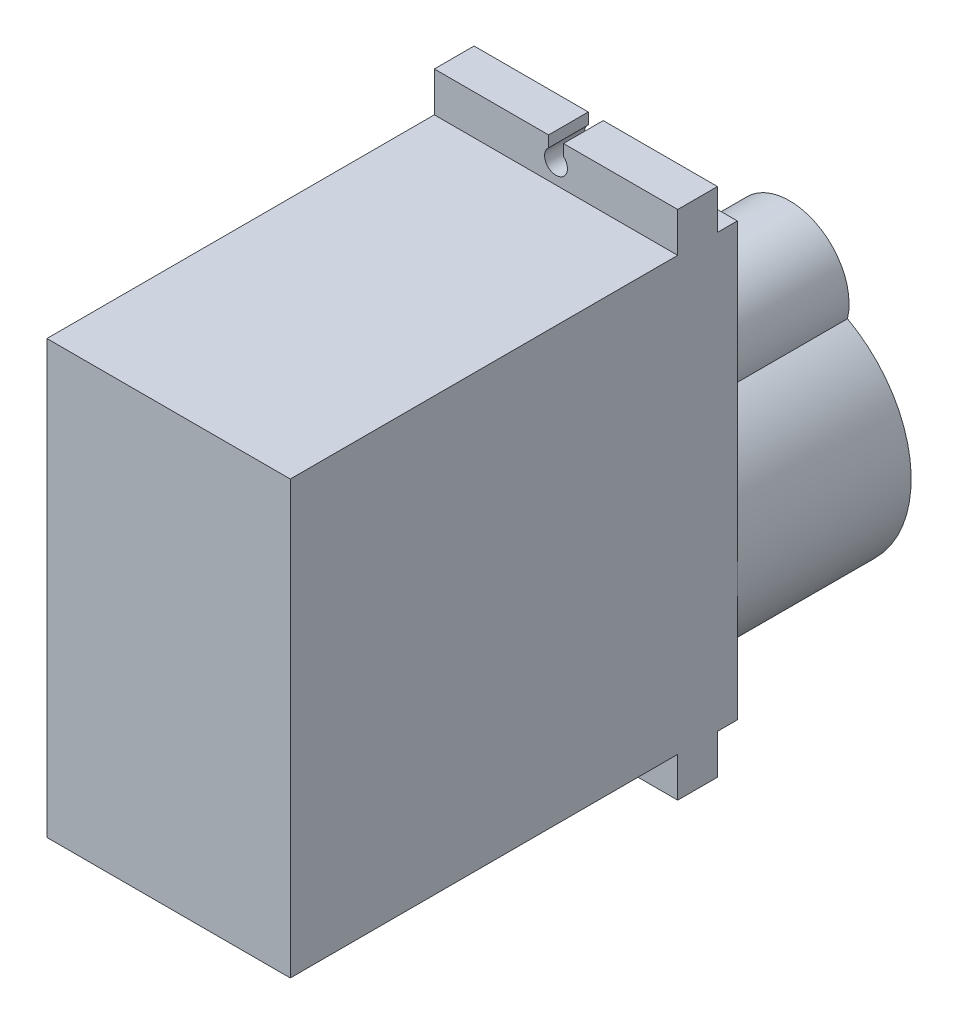
ISO-10303-21;
HEADER;
FILE_DESCRIPTION(('STEP AP214'),'2;1');
FILE_NAME('part.step','',(''),(''),'','','');
FILE_SCHEMA(('AUTOMOTIVE_DESIGN { 1 0 10303 214 1 1 1 1 }'));
ENDSEC;
DATA;
#1=APPLICATION_CONTEXT('core data for automotive mechanical design processes');
#2=APPLICATION_PROTOCOL_DEFINITION('international standard','automotive_design',2000,#1);
#3=PRODUCT_CONTEXT('',#1,'mechanical');
#4=PRODUCT('Part','Part','',(#3));
#5=PRODUCT_RELATED_PRODUCT_CATEGORY('part','',(#4));
#6=PRODUCT_DEFINITION_FORMATION('','',#4);
#7=PRODUCT_DEFINITION_CONTEXT('part definition',#1,'design');
#8=PRODUCT_DEFINITION('design','',#6,#7);
#9=PRODUCT_DEFINITION_SHAPE('','',#8);
#10=(LENGTH_UNIT() NAMED_UNIT(*) SI_UNIT(.MILLI.,.METRE.));
#11=(NAMED_UNIT(*) PLANE_ANGLE_UNIT() SI_UNIT($,.RADIAN.));
#12=(NAMED_UNIT(*) SI_UNIT($,.STERADIAN.) SOLID_ANGLE_UNIT());
#13=UNCERTAINTY_MEASURE_WITH_UNIT(LENGTH_MEASURE(1.E-05),#10,'distance_accuracy_value','');
#14=(GEOMETRIC_REPRESENTATION_CONTEXT(3) GLOBAL_UNCERTAINTY_ASSIGNED_CONTEXT((#13)) GLOBAL_UNIT_ASSIGNED_CONTEXT((#10,
#11,#12)) REPRESENTATION_CONTEXT('',''));
#15=CARTESIAN_POINT('',(0.,0.,0.));
#16=DIRECTION('',(0.,0.,1.));
#17=DIRECTION('',(1.,0.,0.));
#18=AXIS2_PLACEMENT_3D('',#15,#16,#17);
#19=CARTESIAN_POINT('',(0.,0.,0.));
#20=DIRECTION('',(0.,0.,1.));
#21=DIRECTION('',(1.,0.,0.));
#22=AXIS2_PLACEMENT_3D('',#19,#20,#21);
#23=PLANE('',#22);
#24=CARTESIAN_POINT('',(0.,1.34148615376189,0.));
#25=DIRECTION('',(0.,0.,-1.));
#26=DIRECTION('',(1.,0.,0.));
#27=AXIS2_PLACEMENT_3D('',#24,#25,#26);
#28=CIRCLE('',#27,3.048);
#29=CARTESIAN_POINT('',(-2.96714197488398,0.644082037856617,0.));
#30=VERTEX_POINT('',#29);
#31=CARTESIAN_POINT('',(2.96714197488398,0.644082037856617,0.));
#32=VERTEX_POINT('',#31);
#33=EDGE_CURVE('E217',#30,#32,#28,.T.);
#34=ORIENTED_EDGE('',*,*,#33,.F.);
#35=CARTESIAN_POINT('',(0.,-4.826,0.));
#36=DIRECTION('',(0.,0.,-1.));
#37=DIRECTION('',(-1.,0.,0.));
#38=AXIS2_PLACEMENT_3D('',#35,#36,#37);
#39=CIRCLE('',#38,6.223);
#40=CARTESIAN_POINT('',(-6.223,-4.826,0.));
#41=VERTEX_POINT('',#40);
#42=EDGE_CURVE('E628',#41,#30,#39,.T.);
#43=ORIENTED_EDGE('',*,*,#42,.F.);
#44=DIRECTION('',(0.,-1.,0.));
#45=VECTOR('',#44,1.);
#46=CARTESIAN_POINT('',(-6.223,-11.049,0.));
#47=LINE('',#46,#45);
#48=CARTESIAN_POINT('',(-6.223,11.049,0.));
#49=VERTEX_POINT('',#48);
#50=EDGE_CURVE('E342',#49,#41,#47,.T.);
#51=ORIENTED_EDGE('',*,*,#50,.F.);
#52=DIRECTION('',(-1.,0.,0.));
#53=VECTOR('',#52,1.);
#54=CARTESIAN_POINT('',(6.223,11.049,0.));
#55=LINE('',#54,#53);
#56=CARTESIAN_POINT('',(6.223,11.049,0.));
#57=VERTEX_POINT('',#56);
#58=EDGE_CURVE('E335',#57,#49,#55,.T.);
#59=ORIENTED_EDGE('',*,*,#58,.F.);
#60=DIRECTION('',(0.,1.,0.));
#61=VECTOR('',#60,1.);
#62=CARTESIAN_POINT('',(6.223,-11.049,0.));
#63=LINE('',#62,#61);
#64=CARTESIAN_POINT('',(6.223,-4.826,0.));
#65=VERTEX_POINT('',#64);
#66=EDGE_CURVE('E349',#65,#57,#63,.T.);
#67=ORIENTED_EDGE('',*,*,#66,.F.);
#68=EDGE_CURVE('E50',#32,#65,#39,.T.);
#69=ORIENTED_EDGE('',*,*,#68,.F.);
#70=EDGE_LOOP('',(#34,#43,#51,#59,#67,#69));
#71=FACE_BOUND('',#70,.T.);
#72=ADVANCED_FACE('F39',(#71),#23,.F.);
#73=CARTESIAN_POINT('',(0.,-11.049,0.));
#74=VERTEX_POINT('',#73);
#75=EDGE_CURVE('E11',#65,#74,#39,.T.);
#76=ORIENTED_EDGE('',*,*,#75,.F.);
#77=CARTESIAN_POINT('',(6.223,-11.049,0.));
#78=VERTEX_POINT('',#77);
#79=EDGE_CURVE('E350',#78,#65,#63,.T.);
#80=ORIENTED_EDGE('',*,*,#79,.F.);
#81=DIRECTION('',(1.,0.,0.));
#82=VECTOR('',#81,1.);
#83=CARTESIAN_POINT('',(6.223,-11.049,0.));
#84=LINE('',#83,#82);
#85=EDGE_CURVE('E345',#74,#78,#84,.T.);
#86=ORIENTED_EDGE('',*,*,#85,.F.);
#87=EDGE_LOOP('',(#76,#80,#86));
#88=FACE_BOUND('',#87,.T.);
#89=ADVANCED_FACE('F376',(#88),#23,.F.);
#90=CARTESIAN_POINT('',(6.223,-13.081,1.016));
#91=DIRECTION('',(0.,0.,-1.));
#92=DIRECTION('',(-1.,0.,0.));
#93=AXIS2_PLACEMENT_3D('',#90,#91,#92);
#94=PLANE('',#93);
#95=DIRECTION('',(-1.,0.,0.));
#96=VECTOR('',#95,1.);
#97=CARTESIAN_POINT('',(6.223,-13.081,1.016));
#98=LINE('',#97,#96);
#99=CARTESIAN_POINT('',(6.223,-13.081,1.016));
#100=VERTEX_POINT('',#99);
#101=CARTESIAN_POINT('',(0.381,-13.081,1.016));
#102=VERTEX_POINT('',#101);
#103=EDGE_CURVE('E251',#100,#102,#98,.T.);
#104=ORIENTED_EDGE('',*,*,#103,.T.);
#105=DIRECTION('',(0.,1.,0.));
#106=VECTOR('',#105,1.);
#107=CARTESIAN_POINT('',(0.381,-13.081,1.016));
#108=LINE('',#107,#106);
#109=CARTESIAN_POINT('',(0.381,-12.5078641326637,1.016));
#110=VERTEX_POINT('',#109);
#111=EDGE_CURVE('E228',#102,#110,#108,.T.);
#112=ORIENTED_EDGE('',*,*,#111,.T.);
#113=CARTESIAN_POINT('',(0.,-12.065,1.016));
#114=DIRECTION('',(0.,0.,1.));
#115=DIRECTION('',(-1.,0.,0.));
#116=AXIS2_PLACEMENT_3D('',#113,#114,#115);
#117=CIRCLE('',#116,0.5842);
#118=CARTESIAN_POINT('',(-0.381,-12.5078641326637,1.016));
#119=VERTEX_POINT('',#118);
#120=EDGE_CURVE('E221',#110,#119,#117,.T.);
#121=ORIENTED_EDGE('',*,*,#120,.T.);
#122=DIRECTION('',(0.,-1.,0.));
#123=VECTOR('',#122,1.);
#124=CARTESIAN_POINT('',(-0.381,-13.081,1.016));
#125=LINE('',#124,#123);
#126=CARTESIAN_POINT('',(-0.381,-13.081,1.016));
#127=VERTEX_POINT('',#126);
#128=EDGE_CURVE('E218',#119,#127,#125,.T.);
#129=ORIENTED_EDGE('',*,*,#128,.T.);
#130=CARTESIAN_POINT('',(-6.223,-13.081,1.016));
#131=VERTEX_POINT('',#130);
#132=EDGE_CURVE('E249',#127,#131,#98,.T.);
#133=ORIENTED_EDGE('',*,*,#132,.T.);
#134=DIRECTION('',(0.,1.,0.));
#135=VECTOR('',#134,1.);
#136=CARTESIAN_POINT('',(-6.223,-13.081,1.016));
#137=LINE('',#136,#135);
#138=CARTESIAN_POINT('',(-6.223,-11.049,1.016));
#139=VERTEX_POINT('',#138);
#140=EDGE_CURVE('E271',#131,#139,#137,.T.);
#141=ORIENTED_EDGE('',*,*,#140,.T.);
#142=DIRECTION('',(-1.,0.,0.));
#143=VECTOR('',#142,1.);
#144=CARTESIAN_POINT('',(6.223,-11.049,1.016));
#145=LINE('',#144,#143);
#146=CARTESIAN_POINT('',(6.223,-11.049,1.016));
#147=VERTEX_POINT('',#146);
#148=EDGE_CURVE('E240',#147,#139,#145,.T.);
#149=ORIENTED_EDGE('',*,*,#148,.F.);
#150=DIRECTION('',(0.,1.,0.));
#151=VECTOR('',#150,1.);
#152=CARTESIAN_POINT('',(6.223,-13.081,1.016));
#153=LINE('',#152,#151);
#154=EDGE_CURVE('E269',#100,#147,#153,.T.);
#155=ORIENTED_EDGE('',*,*,#154,.F.);
#156=EDGE_LOOP('',(#104,#112,#121,#129,#133,#141,#149,#155));
#157=FACE_BOUND('',#156,.T.);
#158=ADVANCED_FACE('F436',(#157),#94,.T.);
#159=CARTESIAN_POINT('',(6.223,-13.081,3.048));
#160=DIRECTION('',(0.,0.,1.));
#161=DIRECTION('',(1.,0.,0.));
#162=AXIS2_PLACEMENT_3D('',#159,#160,#161);
#163=PLANE('',#162);
#164=CARTESIAN_POINT('',(0.,-12.065,3.048));
#165=DIRECTION('',(0.,0.,1.));
#166=DIRECTION('',(-1.,0.,0.));
#167=AXIS2_PLACEMENT_3D('',#164,#165,#166);
#168=CIRCLE('',#167,0.5842);
#169=CARTESIAN_POINT('',(0.381,-12.5078641326637,3.048));
#170=VERTEX_POINT('',#169);
#171=CARTESIAN_POINT('',(-0.381000000000001,-12.5078641326637,3.048));
#172=VERTEX_POINT('',#171);
#173=EDGE_CURVE('E227',#170,#172,#168,.T.);
#174=ORIENTED_EDGE('',*,*,#173,.F.);
#175=DIRECTION('',(0.,1.,0.));
#176=VECTOR('',#175,1.);
#177=CARTESIAN_POINT('',(0.381,-13.081,3.048));
#178=LINE('',#177,#176);
#179=CARTESIAN_POINT('',(0.381,-13.081,3.048));
#180=VERTEX_POINT('',#179);
#181=EDGE_CURVE('E230',#180,#170,#178,.T.);
#182=ORIENTED_EDGE('',*,*,#181,.F.);
#183=DIRECTION('',(1.,0.,0.));
#184=VECTOR('',#183,1.);
#185=CARTESIAN_POINT('',(6.223,-13.081,3.048));
#186=LINE('',#185,#184);
#187=CARTESIAN_POINT('',(6.223,-13.081,3.048));
#188=VERTEX_POINT('',#187);
#189=EDGE_CURVE('E257',#180,#188,#186,.T.);
#190=ORIENTED_EDGE('',*,*,#189,.T.);
#191=DIRECTION('',(0.,1.,0.));
#192=VECTOR('',#191,1.);
#193=CARTESIAN_POINT('',(6.223,-13.081,3.048));
#194=LINE('',#193,#192);
#195=CARTESIAN_POINT('',(6.223,-11.049,3.048));
#196=VERTEX_POINT('',#195);
#197=EDGE_CURVE('E267',#188,#196,#194,.T.);
#198=ORIENTED_EDGE('',*,*,#197,.T.);
#199=DIRECTION('',(1.,0.,0.));
#200=VECTOR('',#199,1.);
#201=CARTESIAN_POINT('',(6.223,-11.049,3.048));
#202=LINE('',#201,#200);
#203=CARTESIAN_POINT('',(-6.223,-11.049,3.048));
#204=VERTEX_POINT('',#203);
#205=EDGE_CURVE('E250',#204,#196,#202,.T.);
#206=ORIENTED_EDGE('',*,*,#205,.F.);
#207=DIRECTION('',(0.,1.,0.));
#208=VECTOR('',#207,1.);
#209=CARTESIAN_POINT('',(-6.223,-13.081,3.048));
#210=LINE('',#209,#208);
#211=CARTESIAN_POINT('',(-6.223,-13.081,3.048));
#212=VERTEX_POINT('',#211);
#213=EDGE_CURVE('E261',#212,#204,#210,.T.);
#214=ORIENTED_EDGE('',*,*,#213,.F.);
#215=CARTESIAN_POINT('',(-0.380999999999999,-13.081,3.048));
#216=VERTEX_POINT('',#215);
#217=EDGE_CURVE('E258',#212,#216,#186,.T.);
#218=ORIENTED_EDGE('',*,*,#217,.T.);
#219=DIRECTION('',(0.,-1.,0.));
#220=VECTOR('',#219,1.);
#221=CARTESIAN_POINT('',(-0.381,-13.081,3.048));
#222=LINE('',#221,#220);
#223=EDGE_CURVE('E225',#172,#216,#222,.T.);
#224=ORIENTED_EDGE('',*,*,#223,.F.);
#225=EDGE_LOOP('',(#174,#182,#190,#198,#206,#214,#218,#224));
#226=FACE_BOUND('',#225,.T.);
#227=ADVANCED_FACE('F428',(#226),#163,.T.);
#228=CARTESIAN_POINT('',(0.,-13.081,0.));
#229=DIRECTION('',(0.,-1.,0.));
#230=DIRECTION('',(0.,0.,1.));
#231=AXIS2_PLACEMENT_3D('',#228,#229,#230);
#232=PLANE('',#231);
#233=ORIENTED_EDGE('',*,*,#189,.F.);
#234=DIRECTION('',(0.,0.,-1.));
#235=VECTOR('',#234,1.);
#236=CARTESIAN_POINT('',(0.381,-13.081,3.048));
#237=LINE('',#236,#235);
#238=EDGE_CURVE('E237',#180,#102,#237,.T.);
#239=ORIENTED_EDGE('',*,*,#238,.T.);
#240=ORIENTED_EDGE('',*,*,#103,.F.);
#241=DIRECTION('',(0.,0.,-1.));
#242=VECTOR('',#241,1.);
#243=CARTESIAN_POINT('',(6.223,-13.081,3.048));
#244=LINE('',#243,#242);
#245=EDGE_CURVE('E254',#188,#100,#244,.T.);
#246=ORIENTED_EDGE('',*,*,#245,.F.);
#247=EDGE_LOOP('',(#233,#239,#240,#246));
#248=FACE_BOUND('',#247,.T.);
#249=ADVANCED_FACE('F434',(#248),#232,.T.);
#250=ORIENTED_EDGE('',*,*,#132,.F.);
#251=DIRECTION('',(0.,0.,-1.));
#252=VECTOR('',#251,1.);
#253=CARTESIAN_POINT('',(-0.381,-13.081,3.048));
#254=LINE('',#253,#252);
#255=EDGE_CURVE('E231',#216,#127,#254,.T.);
#256=ORIENTED_EDGE('',*,*,#255,.F.);
#257=ORIENTED_EDGE('',*,*,#217,.F.);
#258=DIRECTION('',(0.,0.,1.));
#259=VECTOR('',#258,1.);
#260=CARTESIAN_POINT('',(-6.223,-13.081,3.048));
#261=LINE('',#260,#259);
#262=EDGE_CURVE('E246',#131,#212,#261,.T.);
#263=ORIENTED_EDGE('',*,*,#262,.F.);
#264=EDGE_LOOP('',(#250,#256,#257,#263));
#265=FACE_BOUND('',#264,.T.);
#266=ADVANCED_FACE('F509',(#265),#232,.T.);
#267=CARTESIAN_POINT('',(6.223,-11.049,22.86));
#268=DIRECTION('',(0.,1.,0.));
#269=DIRECTION('',(0.,0.,1.));
#270=AXIS2_PLACEMENT_3D('',#267,#268,#269);
#271=PLANE('',#270);
#272=DIRECTION('',(0.,0.,-1.));
#273=VECTOR('',#272,1.);
#274=CARTESIAN_POINT('',(-6.223,-11.049,22.86));
#275=LINE('',#274,#273);
#276=CARTESIAN_POINT('',(-6.223,-11.049,22.86));
#277=VERTEX_POINT('',#276);
#278=EDGE_CURVE('E43',#277,#204,#275,.T.);
#279=ORIENTED_EDGE('',*,*,#278,.T.);
#280=ORIENTED_EDGE('',*,*,#205,.T.);
#281=DIRECTION('',(0.,0.,-1.));
#282=VECTOR('',#281,1.);
#283=CARTESIAN_POINT('',(6.223,-11.049,22.86));
#284=LINE('',#283,#282);
#285=CARTESIAN_POINT('',(6.223,-11.049,22.86));
#286=VERTEX_POINT('',#285);
#287=EDGE_CURVE('E361',#286,#196,#284,.T.);
#288=ORIENTED_EDGE('',*,*,#287,.F.);
#289=DIRECTION('',(1.,0.,0.));
#290=VECTOR('',#289,1.);
#291=CARTESIAN_POINT('',(6.223,-11.049,22.86));
#292=LINE('',#291,#290);
#293=EDGE_CURVE('E334',#277,#286,#292,.T.);
#294=ORIENTED_EDGE('',*,*,#293,.F.);
#295=EDGE_LOOP('',(#279,#280,#288,#294));
#296=FACE_BOUND('',#295,.T.);
#297=ADVANCED_FACE('F424',(#296),#271,.F.);
#298=CARTESIAN_POINT('',(0.,13.081,0.));
#299=DIRECTION('',(0.,1.,0.));
#300=DIRECTION('',(0.,0.,1.));
#301=AXIS2_PLACEMENT_3D('',#298,#299,#300);
#302=PLANE('',#301);
#303=DIRECTION('',(0.,0.,-1.));
#304=VECTOR('',#303,1.);
#305=CARTESIAN_POINT('',(-0.381,13.081,3.048));
#306=LINE('',#305,#304);
#307=CARTESIAN_POINT('',(-0.381,13.081,3.048));
#308=VERTEX_POINT('',#307);
#309=CARTESIAN_POINT('',(-0.381,13.081,1.016));
#310=VERTEX_POINT('',#309);
#311=EDGE_CURVE('E291',#308,#310,#306,.T.);
#312=ORIENTED_EDGE('',*,*,#311,.T.);
#313=DIRECTION('',(-1.,0.,0.));
#314=VECTOR('',#313,1.);
#315=CARTESIAN_POINT('',(6.223,13.081,1.016));
#316=LINE('',#315,#314);
#317=CARTESIAN_POINT('',(-6.223,13.081,1.016));
#318=VERTEX_POINT('',#317);
#319=EDGE_CURVE('E310',#310,#318,#316,.T.);
#320=ORIENTED_EDGE('',*,*,#319,.T.);
#321=DIRECTION('',(0.,0.,1.));
#322=VECTOR('',#321,1.);
#323=CARTESIAN_POINT('',(-6.223,13.081,3.048));
#324=LINE('',#323,#322);
#325=CARTESIAN_POINT('',(-6.223,13.081,3.048));
#326=VERTEX_POINT('',#325);
#327=EDGE_CURVE('E300',#318,#326,#324,.T.);
#328=ORIENTED_EDGE('',*,*,#327,.T.);
#329=DIRECTION('',(1.,0.,0.));
#330=VECTOR('',#329,1.);
#331=CARTESIAN_POINT('',(6.223,13.081,3.048));
#332=LINE('',#331,#330);
#333=EDGE_CURVE('E305',#326,#308,#332,.T.);
#334=ORIENTED_EDGE('',*,*,#333,.T.);
#335=EDGE_LOOP('',(#312,#320,#328,#334));
#336=FACE_BOUND('',#335,.T.);
#337=ADVANCED_FACE('F393',(#336),#302,.T.);
#338=CARTESIAN_POINT('',(6.223,11.049,22.86));
#339=DIRECTION('',(0.,-1.,0.));
#340=DIRECTION('',(0.,0.,-1.));
#341=AXIS2_PLACEMENT_3D('',#338,#339,#340);
#342=PLANE('',#341);
#343=DIRECTION('',(-1.,0.,0.));
#344=VECTOR('',#343,1.);
#345=CARTESIAN_POINT('',(6.223,11.049,1.016));
#346=LINE('',#345,#344);
#347=CARTESIAN_POINT('',(6.223,11.049,1.016));
#348=VERTEX_POINT('',#347);
#349=CARTESIAN_POINT('',(-6.223,11.049,1.016));
#350=VERTEX_POINT('',#349);
#351=EDGE_CURVE('E304',#348,#350,#346,.T.);
#352=ORIENTED_EDGE('',*,*,#351,.F.);
#353=DIRECTION('',(0.,0.,-1.));
#354=VECTOR('',#353,1.);
#355=CARTESIAN_POINT('',(6.223,11.049,22.86));
#356=LINE('',#355,#354);
#357=EDGE_CURVE('E358',#348,#57,#356,.T.);
#358=ORIENTED_EDGE('',*,*,#357,.T.);
#359=ORIENTED_EDGE('',*,*,#58,.T.);
#360=DIRECTION('',(0.,0.,-1.));
#361=VECTOR('',#360,1.);
#362=CARTESIAN_POINT('',(-6.223,11.049,22.86));
#363=LINE('',#362,#361);
#364=EDGE_CURVE('E341',#350,#49,#363,.T.);
#365=ORIENTED_EDGE('',*,*,#364,.F.);
#366=EDGE_LOOP('',(#352,#358,#359,#365));
#367=FACE_BOUND('',#366,.T.);
#368=ADVANCED_FACE('F383',(#367),#342,.F.);
#369=DIRECTION('',(1.,0.,0.));
#370=VECTOR('',#369,1.);
#371=CARTESIAN_POINT('',(6.223,11.049,3.048));
#372=LINE('',#371,#370);
#373=CARTESIAN_POINT('',(-6.223,11.049,3.048));
#374=VERTEX_POINT('',#373);
#375=CARTESIAN_POINT('',(6.223,11.049,3.048));
#376=VERTEX_POINT('',#375);
#377=EDGE_CURVE('E294',#374,#376,#372,.T.);
#378=ORIENTED_EDGE('',*,*,#377,.F.);
#379=CARTESIAN_POINT('',(-6.223,11.049,22.86));
#380=VERTEX_POINT('',#379);
#381=EDGE_CURVE('E355',#380,#374,#363,.T.);
#382=ORIENTED_EDGE('',*,*,#381,.F.);
#383=DIRECTION('',(-1.,0.,0.));
#384=VECTOR('',#383,1.);
#385=CARTESIAN_POINT('',(6.223,11.049,22.86));
#386=LINE('',#385,#384);
#387=CARTESIAN_POINT('',(6.223,11.049,22.86));
#388=VERTEX_POINT('',#387);
#389=EDGE_CURVE('E339',#388,#380,#386,.T.);
#390=ORIENTED_EDGE('',*,*,#389,.F.);
#391=EDGE_CURVE('E359',#388,#376,#356,.T.);
#392=ORIENTED_EDGE('',*,*,#391,.T.);
#393=EDGE_LOOP('',(#378,#382,#390,#392));
#394=FACE_BOUND('',#393,.T.);
#395=ADVANCED_FACE('F417',(#394),#342,.F.);
#396=CARTESIAN_POINT('',(-6.223,-11.049,22.86));
#397=DIRECTION('',(1.,0.,0.));
#398=DIRECTION('',(0.,0.,-1.));
#399=AXIS2_PLACEMENT_3D('',#396,#397,#398);
#400=PLANE('',#399);
#401=ORIENTED_EDGE('',*,*,#50,.T.);
#402=CARTESIAN_POINT('',(-6.223,-11.049,0.));
#403=VERTEX_POINT('',#402);
#404=EDGE_CURVE('E330',#41,#403,#47,.T.);
#405=ORIENTED_EDGE('',*,*,#404,.T.);
#406=EDGE_CURVE('E363',#139,#403,#275,.T.);
#407=ORIENTED_EDGE('',*,*,#406,.F.);
#408=ORIENTED_EDGE('',*,*,#140,.F.);
#409=ORIENTED_EDGE('',*,*,#262,.T.);
#410=ORIENTED_EDGE('',*,*,#213,.T.);
#411=ORIENTED_EDGE('',*,*,#278,.F.);
#412=DIRECTION('',(0.,-1.,0.));
#413=VECTOR('',#412,1.);
#414=CARTESIAN_POINT('',(-6.223,-11.049,22.86));
#415=LINE('',#414,#413);
#416=EDGE_CURVE('E331',#380,#277,#415,.T.);
#417=ORIENTED_EDGE('',*,*,#416,.F.);
#418=ORIENTED_EDGE('',*,*,#381,.T.);
#419=DIRECTION('',(0.,-1.,0.));
#420=VECTOR('',#419,1.);
#421=CARTESIAN_POINT('',(-6.223,13.081,3.048));
#422=LINE('',#421,#420);
#423=EDGE_CURVE('E327',#326,#374,#422,.T.);
#424=ORIENTED_EDGE('',*,*,#423,.F.);
#425=ORIENTED_EDGE('',*,*,#327,.F.);
#426=DIRECTION('',(0.,-1.,0.));
#427=VECTOR('',#426,1.);
#428=CARTESIAN_POINT('',(-6.223,13.081,1.016));
#429=LINE('',#428,#427);
#430=EDGE_CURVE('E314',#318,#350,#429,.T.);
#431=ORIENTED_EDGE('',*,*,#430,.T.);
#432=ORIENTED_EDGE('',*,*,#364,.T.);
#433=EDGE_LOOP('',(#401,#405,#407,#408,#409,#410,#411,#417,#418,#424,#425,#431,#432));
#434=FACE_BOUND('',#433,.T.);
#435=ADVANCED_FACE('F41',(#434),#400,.F.);
#436=EDGE_CURVE('E360',#147,#78,#284,.T.);
#437=ORIENTED_EDGE('',*,*,#436,.F.);
#438=ORIENTED_EDGE('',*,*,#148,.T.);
#439=ORIENTED_EDGE('',*,*,#406,.T.);
#440=EDGE_CURVE('E346',#403,#74,#84,.T.);
#441=ORIENTED_EDGE('',*,*,#440,.T.);
#442=ORIENTED_EDGE('',*,*,#85,.T.);
#443=EDGE_LOOP('',(#437,#438,#439,#441,#442));
#444=FACE_BOUND('',#443,.T.);
#445=ADVANCED_FACE('F439',(#444),#271,.F.);
#446=CARTESIAN_POINT('',(6.223,-11.049,22.86));
#447=DIRECTION('',(-1.,0.,0.));
#448=DIRECTION('',(0.,0.,1.));
#449=AXIS2_PLACEMENT_3D('',#446,#447,#448);
#450=PLANE('',#449);
#451=ORIENTED_EDGE('',*,*,#79,.T.);
#452=ORIENTED_EDGE('',*,*,#66,.T.);
#453=ORIENTED_EDGE('',*,*,#357,.F.);
#454=DIRECTION('',(0.,-1.,0.));
#455=VECTOR('',#454,1.);
#456=CARTESIAN_POINT('',(6.223,13.081,1.016));
#457=LINE('',#456,#455);
#458=CARTESIAN_POINT('',(6.223,13.081,1.016));
#459=VERTEX_POINT('',#458);
#460=EDGE_CURVE('E321',#459,#348,#457,.T.);
#461=ORIENTED_EDGE('',*,*,#460,.F.);
#462=DIRECTION('',(0.,0.,-1.));
#463=VECTOR('',#462,1.);
#464=CARTESIAN_POINT('',(6.223,13.081,3.048));
#465=LINE('',#464,#463);
#466=CARTESIAN_POINT('',(6.223,13.081,3.048));
#467=VERTEX_POINT('',#466);
#468=EDGE_CURVE('E308',#467,#459,#465,.T.);
#469=ORIENTED_EDGE('',*,*,#468,.F.);
#470=DIRECTION('',(0.,-1.,0.));
#471=VECTOR('',#470,1.);
#472=CARTESIAN_POINT('',(6.223,13.081,3.048));
#473=LINE('',#472,#471);
#474=EDGE_CURVE('E324',#467,#376,#473,.T.);
#475=ORIENTED_EDGE('',*,*,#474,.T.);
#476=ORIENTED_EDGE('',*,*,#391,.F.);
#477=DIRECTION('',(0.,1.,0.));
#478=VECTOR('',#477,1.);
#479=CARTESIAN_POINT('',(6.223,-11.049,22.86));
#480=LINE('',#479,#478);
#481=EDGE_CURVE('E337',#286,#388,#480,.T.);
#482=ORIENTED_EDGE('',*,*,#481,.F.);
#483=ORIENTED_EDGE('',*,*,#287,.T.);
#484=ORIENTED_EDGE('',*,*,#197,.F.);
#485=ORIENTED_EDGE('',*,*,#245,.T.);
#486=ORIENTED_EDGE('',*,*,#154,.T.);
#487=ORIENTED_EDGE('',*,*,#436,.T.);
#488=EDGE_LOOP('',(#451,#452,#453,#461,#469,#475,#476,#482,#483,#484,#485,#486,#487));
#489=FACE_BOUND('',#488,.T.);
#490=ADVANCED_FACE('F372',(#489),#450,.F.);
#491=CARTESIAN_POINT('',(0.,0.,22.86));
#492=DIRECTION('',(0.,0.,1.));
#493=DIRECTION('',(1.,0.,0.));
#494=AXIS2_PLACEMENT_3D('',#491,#492,#493);
#495=PLANE('',#494);
#496=ORIENTED_EDGE('',*,*,#416,.T.);
#497=ORIENTED_EDGE('',*,*,#293,.T.);
#498=ORIENTED_EDGE('',*,*,#481,.T.);
#499=ORIENTED_EDGE('',*,*,#389,.T.);
#500=EDGE_LOOP('',(#496,#497,#498,#499));
#501=FACE_BOUND('',#500,.T.);
#502=ADVANCED_FACE('F422',(#501),#495,.T.);
#503=EDGE_CURVE('E48',#74,#41,#39,.T.);
#504=ORIENTED_EDGE('',*,*,#503,.F.);
#505=ORIENTED_EDGE('',*,*,#440,.F.);
#506=ORIENTED_EDGE('',*,*,#404,.F.);
#507=EDGE_LOOP('',(#504,#505,#506));
#508=FACE_BOUND('',#507,.T.);
#509=ADVANCED_FACE('F441',(#508),#23,.F.);
#510=CARTESIAN_POINT('',(6.223,13.081,3.048));
#511=DIRECTION('',(0.,0.,-1.));
#512=DIRECTION('',(-1.,0.,0.));
#513=AXIS2_PLACEMENT_3D('',#510,#511,#512);
#514=PLANE('',#513);
#515=CARTESIAN_POINT('',(0.,12.065,3.048));
#516=DIRECTION('',(0.,0.,-1.));
#517=DIRECTION('',(-1.,0.,0.));
#518=AXIS2_PLACEMENT_3D('',#515,#516,#517);
#519=CIRCLE('',#518,0.5842);
#520=CARTESIAN_POINT('',(0.381,12.5078641326637,3.048));
#521=VERTEX_POINT('',#520);
#522=CARTESIAN_POINT('',(-0.381000000000001,12.5078641326637,3.048));
#523=VERTEX_POINT('',#522);
#524=EDGE_CURVE('E277',#521,#523,#519,.T.);
#525=ORIENTED_EDGE('',*,*,#524,.T.);
#526=DIRECTION('',(0.,1.,0.));
#527=VECTOR('',#526,1.);
#528=CARTESIAN_POINT('',(-0.381,13.081,3.048));
#529=LINE('',#528,#527);
#530=EDGE_CURVE('E281',#523,#308,#529,.T.);
#531=ORIENTED_EDGE('',*,*,#530,.T.);
#532=ORIENTED_EDGE('',*,*,#333,.F.);
#533=ORIENTED_EDGE('',*,*,#423,.T.);
#534=ORIENTED_EDGE('',*,*,#377,.T.);
#535=ORIENTED_EDGE('',*,*,#474,.F.);
#536=CARTESIAN_POINT('',(0.381000000000001,13.081,3.048));
#537=VERTEX_POINT('',#536);
#538=EDGE_CURVE('E303',#537,#467,#332,.T.);
#539=ORIENTED_EDGE('',*,*,#538,.F.);
#540=DIRECTION('',(0.,-1.,0.));
#541=VECTOR('',#540,1.);
#542=CARTESIAN_POINT('',(0.381,13.081,3.048));
#543=LINE('',#542,#541);
#544=EDGE_CURVE('E274',#537,#521,#543,.T.);
#545=ORIENTED_EDGE('',*,*,#544,.T.);
#546=EDGE_LOOP('',(#525,#531,#532,#533,#534,#535,#539,#545));
#547=FACE_BOUND('',#546,.T.);
#548=ADVANCED_FACE('F414',(#547),#514,.F.);
#549=CARTESIAN_POINT('',(6.223,13.081,1.016));
#550=DIRECTION('',(0.,0.,1.));
#551=DIRECTION('',(1.,0.,0.));
#552=AXIS2_PLACEMENT_3D('',#549,#550,#551);
#553=PLANE('',#552);
#554=ORIENTED_EDGE('',*,*,#319,.F.);
#555=DIRECTION('',(0.,1.,0.));
#556=VECTOR('',#555,1.);
#557=CARTESIAN_POINT('',(-0.381,13.081,1.016));
#558=LINE('',#557,#556);
#559=CARTESIAN_POINT('',(-0.381,12.5078641326637,1.016));
#560=VERTEX_POINT('',#559);
#561=EDGE_CURVE('E278',#560,#310,#558,.T.);
#562=ORIENTED_EDGE('',*,*,#561,.F.);
#563=CARTESIAN_POINT('',(0.,12.065,1.016));
#564=DIRECTION('',(0.,0.,-1.));
#565=DIRECTION('',(-1.,0.,0.));
#566=AXIS2_PLACEMENT_3D('',#563,#564,#565);
#567=CIRCLE('',#566,0.5842);
#568=CARTESIAN_POINT('',(0.381,12.5078641326637,1.016));
#569=VERTEX_POINT('',#568);
#570=EDGE_CURVE('E287',#569,#560,#567,.T.);
#571=ORIENTED_EDGE('',*,*,#570,.F.);
#572=DIRECTION('',(0.,-1.,0.));
#573=VECTOR('',#572,1.);
#574=CARTESIAN_POINT('',(0.381,13.081,1.016));
#575=LINE('',#574,#573);
#576=CARTESIAN_POINT('',(0.381,13.081,1.016));
#577=VERTEX_POINT('',#576);
#578=EDGE_CURVE('E273',#577,#569,#575,.T.);
#579=ORIENTED_EDGE('',*,*,#578,.F.);
#580=EDGE_CURVE('E311',#459,#577,#316,.T.);
#581=ORIENTED_EDGE('',*,*,#580,.F.);
#582=ORIENTED_EDGE('',*,*,#460,.T.);
#583=ORIENTED_EDGE('',*,*,#351,.T.);
#584=ORIENTED_EDGE('',*,*,#430,.F.);
#585=EDGE_LOOP('',(#554,#562,#571,#579,#581,#582,#583,#584));
#586=FACE_BOUND('',#585,.T.);
#587=ADVANCED_FACE('F387',(#586),#553,.F.);
#588=DIRECTION('',(0.,0.,-1.));
#589=VECTOR('',#588,1.);
#590=CARTESIAN_POINT('',(0.381,13.081,3.048));
#591=LINE('',#590,#589);
#592=EDGE_CURVE('E284',#537,#577,#591,.T.);
#593=ORIENTED_EDGE('',*,*,#592,.F.);
#594=ORIENTED_EDGE('',*,*,#538,.T.);
#595=ORIENTED_EDGE('',*,*,#468,.T.);
#596=ORIENTED_EDGE('',*,*,#580,.T.);
#597=EDGE_LOOP('',(#593,#594,#595,#596));
#598=FACE_BOUND('',#597,.T.);
#599=ADVANCED_FACE('F407',(#598),#302,.T.);
#600=CARTESIAN_POINT('',(-0.381,13.081,3.048));
#601=DIRECTION('',(-1.,0.,0.));
#602=DIRECTION('',(0.,-1.,0.));
#603=AXIS2_PLACEMENT_3D('',#600,#601,#602);
#604=PLANE('',#603);
#605=ORIENTED_EDGE('',*,*,#561,.T.);
#606=ORIENTED_EDGE('',*,*,#311,.F.);
#607=ORIENTED_EDGE('',*,*,#530,.F.);
#608=DIRECTION('',(0.,0.,-1.));
#609=VECTOR('',#608,1.);
#610=CARTESIAN_POINT('',(-0.381000000000001,12.5078641326637,3.048));
#611=LINE('',#610,#609);
#612=EDGE_CURVE('E295',#523,#560,#611,.T.);
#613=ORIENTED_EDGE('',*,*,#612,.T.);
#614=EDGE_LOOP('',(#605,#606,#607,#613));
#615=FACE_BOUND('',#614,.T.);
#616=ADVANCED_FACE('F398',(#615),#604,.F.);
#617=CARTESIAN_POINT('',(0.,12.065,3.048));
#618=DIRECTION('',(0.,0.,-1.));
#619=DIRECTION('',(-1.,0.,0.));
#620=AXIS2_PLACEMENT_3D('',#617,#618,#619);
#621=CYLINDRICAL_SURFACE('',#620,0.5842);
#622=ORIENTED_EDGE('',*,*,#570,.T.);
#623=ORIENTED_EDGE('',*,*,#612,.F.);
#624=ORIENTED_EDGE('',*,*,#524,.F.);
#625=DIRECTION('',(0.,0.,-1.));
#626=VECTOR('',#625,1.);
#627=CARTESIAN_POINT('',(0.381,12.5078641326637,3.048));
#628=LINE('',#627,#626);
#629=EDGE_CURVE('E297',#521,#569,#628,.T.);
#630=ORIENTED_EDGE('',*,*,#629,.T.);
#631=EDGE_LOOP('',(#622,#623,#624,#630));
#632=FACE_BOUND('',#631,.T.);
#633=ADVANCED_FACE('F402',(#632),#621,.F.);
#634=CARTESIAN_POINT('',(0.381,13.081,3.048));
#635=DIRECTION('',(1.,0.,0.));
#636=DIRECTION('',(0.,1.,0.));
#637=AXIS2_PLACEMENT_3D('',#634,#635,#636);
#638=PLANE('',#637);
#639=ORIENTED_EDGE('',*,*,#578,.T.);
#640=ORIENTED_EDGE('',*,*,#629,.F.);
#641=ORIENTED_EDGE('',*,*,#544,.F.);
#642=ORIENTED_EDGE('',*,*,#592,.T.);
#643=EDGE_LOOP('',(#639,#640,#641,#642));
#644=FACE_BOUND('',#643,.T.);
#645=ADVANCED_FACE('F404',(#644),#638,.F.);
#646=CARTESIAN_POINT('',(0.381,-13.081,3.048));
#647=DIRECTION('',(-1.,0.,0.));
#648=DIRECTION('',(0.,-1.,0.));
#649=AXIS2_PLACEMENT_3D('',#646,#647,#648);
#650=PLANE('',#649);
#651=ORIENTED_EDGE('',*,*,#111,.F.);
#652=ORIENTED_EDGE('',*,*,#238,.F.);
#653=ORIENTED_EDGE('',*,*,#181,.T.);
#654=DIRECTION('',(0.,0.,-1.));
#655=VECTOR('',#654,1.);
#656=CARTESIAN_POINT('',(0.381,-12.5078641326637,3.048));
#657=LINE('',#656,#655);
#658=EDGE_CURVE('E241',#170,#110,#657,.T.);
#659=ORIENTED_EDGE('',*,*,#658,.T.);
#660=EDGE_LOOP('',(#651,#652,#653,#659));
#661=FACE_BOUND('',#660,.T.);
#662=ADVANCED_FACE('F473',(#661),#650,.T.);
#663=CARTESIAN_POINT('',(0.,-12.065,3.048));
#664=DIRECTION('',(0.,0.,-1.));
#665=DIRECTION('',(-1.,0.,0.));
#666=AXIS2_PLACEMENT_3D('',#663,#664,#665);
#667=CYLINDRICAL_SURFACE('',#666,0.5842);
#668=ORIENTED_EDGE('',*,*,#120,.F.);
#669=ORIENTED_EDGE('',*,*,#658,.F.);
#670=ORIENTED_EDGE('',*,*,#173,.T.);
#671=DIRECTION('',(0.,0.,-1.));
#672=VECTOR('',#671,1.);
#673=CARTESIAN_POINT('',(-0.381000000000001,-12.5078641326637,3.048));
#674=LINE('',#673,#672);
#675=EDGE_CURVE('E243',#172,#119,#674,.T.);
#676=ORIENTED_EDGE('',*,*,#675,.T.);
#677=EDGE_LOOP('',(#668,#669,#670,#676));
#678=FACE_BOUND('',#677,.T.);
#679=ADVANCED_FACE('F546',(#678),#667,.F.);
#680=CARTESIAN_POINT('',(-0.381,-13.081,3.048));
#681=DIRECTION('',(1.,0.,0.));
#682=DIRECTION('',(0.,1.,0.));
#683=AXIS2_PLACEMENT_3D('',#680,#681,#682);
#684=PLANE('',#683);
#685=ORIENTED_EDGE('',*,*,#128,.F.);
#686=ORIENTED_EDGE('',*,*,#675,.F.);
#687=ORIENTED_EDGE('',*,*,#223,.T.);
#688=ORIENTED_EDGE('',*,*,#255,.T.);
#689=EDGE_LOOP('',(#685,#686,#687,#688));
#690=FACE_BOUND('',#689,.T.);
#691=ADVANCED_FACE('F555',(#690),#684,.T.);
#692=CARTESIAN_POINT('',(0.,1.34148615376189,-8.89));
#693=DIRECTION('',(0.,0.,1.));
#694=DIRECTION('',(1.,0.,0.));
#695=AXIS2_PLACEMENT_3D('',#692,#693,#694);
#696=CYLINDRICAL_SURFACE('',#695,3.048);
#697=ORIENTED_EDGE('',*,*,#33,.T.);
#698=DIRECTION('',(0.,0.,1.));
#699=VECTOR('',#698,1.);
#700=CARTESIAN_POINT('',(2.96714197488398,0.644082037856617,-8.89));
#701=LINE('',#700,#699);
#702=CARTESIAN_POINT('',(2.96714197488398,0.644082037856617,-8.89));
#703=VERTEX_POINT('',#702);
#704=EDGE_CURVE('E204',#703,#32,#701,.T.);
#705=ORIENTED_EDGE('',*,*,#704,.F.);
#706=CARTESIAN_POINT('',(0.,1.34148615376189,-8.89));
#707=DIRECTION('',(0.,0.,-1.));
#708=DIRECTION('',(1.,0.,0.));
#709=AXIS2_PLACEMENT_3D('',#706,#707,#708);
#710=CIRCLE('',#709,3.048);
#711=CARTESIAN_POINT('',(-2.96714197488398,0.644082037856617,-8.89));
#712=VERTEX_POINT('',#711);
#713=EDGE_CURVE('E211',#712,#703,#710,.T.);
#714=ORIENTED_EDGE('',*,*,#713,.F.);
#715=DIRECTION('',(0.,0.,1.));
#716=VECTOR('',#715,1.);
#717=CARTESIAN_POINT('',(-2.96714197488398,0.644082037856617,-8.89));
#718=LINE('',#717,#716);
#719=EDGE_CURVE('E208',#712,#30,#718,.T.);
#720=ORIENTED_EDGE('',*,*,#719,.T.);
#721=EDGE_LOOP('',(#697,#705,#714,#720));
#722=FACE_BOUND('',#721,.T.);
#723=ADVANCED_FACE('F216',(#722),#696,.T.);
#724=CARTESIAN_POINT('',(0.,-4.826,-8.89));
#725=DIRECTION('',(0.,0.,1.));
#726=DIRECTION('',(1.,0.,0.));
#727=AXIS2_PLACEMENT_3D('',#724,#725,#726);
#728=CYLINDRICAL_SURFACE('',#727,6.223);
#729=ORIENTED_EDGE('',*,*,#68,.T.);
#730=ORIENTED_EDGE('',*,*,#75,.T.);
#731=ORIENTED_EDGE('',*,*,#503,.T.);
#732=ORIENTED_EDGE('',*,*,#42,.T.);
#733=ORIENTED_EDGE('',*,*,#719,.F.);
#734=CARTESIAN_POINT('',(0.,-4.826,-8.89));
#735=DIRECTION('',(0.,0.,-1.));
#736=DIRECTION('',(-1.,0.,0.));
#737=AXIS2_PLACEMENT_3D('',#734,#735,#736);
#738=CIRCLE('',#737,6.223);
#739=EDGE_CURVE('E200',#703,#712,#738,.T.);
#740=ORIENTED_EDGE('',*,*,#739,.F.);
#741=ORIENTED_EDGE('',*,*,#704,.T.);
#742=EDGE_LOOP('',(#729,#730,#731,#732,#733,#740,#741));
#743=FACE_BOUND('',#742,.T.);
#744=ADVANCED_FACE('F202',(#743),#728,.T.);
#745=CARTESIAN_POINT('',(0.,-1.74225692311905,-8.89));
#746=DIRECTION('',(0.,0.,1.));
#747=DIRECTION('',(1.,0.,0.));
#748=AXIS2_PLACEMENT_3D('',#745,#746,#747);
#749=PLANE('',#748);
#750=CARTESIAN_POINT('',(0.,-4.826,-8.89));
#751=DIRECTION('',(0.,0.,-1.));
#752=DIRECTION('',(-1.,0.,0.));
#753=AXIS2_PLACEMENT_3D('',#750,#751,#752);
#754=CIRCLE('',#753,2.54);
#755=CARTESIAN_POINT('',(-2.54,-4.826,-8.89));
#756=VERTEX_POINT('',#755);
#757=EDGE_CURVE('E623',#756,#756,#754,.T.);
#758=ORIENTED_EDGE('',*,*,#757,.F.);
#759=EDGE_LOOP('',(#758));
#760=FACE_BOUND('',#759,.T.);
#761=ORIENTED_EDGE('',*,*,#713,.T.);
#762=ORIENTED_EDGE('',*,*,#739,.T.);
#763=EDGE_LOOP('',(#761,#762));
#764=FACE_BOUND('',#763,.T.);
#765=ADVANCED_FACE('F213',(#760,#764),#749,.F.);
#766=CARTESIAN_POINT('',(0.,-4.826,-7.62));
#767=DIRECTION('',(0.,0.,-1.));
#768=DIRECTION('',(-1.,0.,0.));
#769=AXIS2_PLACEMENT_3D('',#766,#767,#768);
#770=CYLINDRICAL_SURFACE('',#769,2.54);
#771=CARTESIAN_POINT('',(0.,-4.826,-7.62));
#772=DIRECTION('',(0.,0.,-1.));
#773=DIRECTION('',(-1.,0.,0.));
#774=AXIS2_PLACEMENT_3D('',#771,#772,#773);
#775=CIRCLE('',#774,2.54);
#776=CARTESIAN_POINT('',(-2.54,-4.826,-7.62));
#777=VERTEX_POINT('',#776);
#778=EDGE_CURVE('E622',#777,#777,#775,.T.);
#779=ORIENTED_EDGE('',*,*,#778,.F.);
#780=EDGE_LOOP('',(#779));
#781=FACE_BOUND('',#780,.T.);
#782=ORIENTED_EDGE('',*,*,#757,.T.);
#783=EDGE_LOOP('',(#782));
#784=FACE_BOUND('',#783,.T.);
#785=ADVANCED_FACE('F594',(#781,#784),#770,.F.);
#786=CARTESIAN_POINT('',(0.,-4.826,-7.62));
#787=DIRECTION('',(0.,0.,-1.));
#788=DIRECTION('',(-1.,0.,0.));
#789=AXIS2_PLACEMENT_3D('',#786,#787,#788);
#790=PLANE('',#789);
#791=ORIENTED_EDGE('',*,*,#778,.T.);
#792=EDGE_LOOP('',(#791));
#793=FACE_BOUND('',#792,.T.);
#794=ADVANCED_FACE('F603',(#793),#790,.T.);
#795=CLOSED_SHELL('',(#72,#89,#158,#227,#249,#266,#297,#337,#368,#395,#435,#445,#490,#502,#509,
#548,#587,#599,#616,#633,#645,#662,#679,#691,#723,#744,#765,#785,#794));
#796=MANIFOLD_SOLID_BREP('B2',#795);
#797=ADVANCED_BREP_SHAPE_REPRESENTATION('',(#18,#796),#14);
#798=SHAPE_DEFINITION_REPRESENTATION(#9,#797);
ENDSEC;
END-ISO-10303-21;
